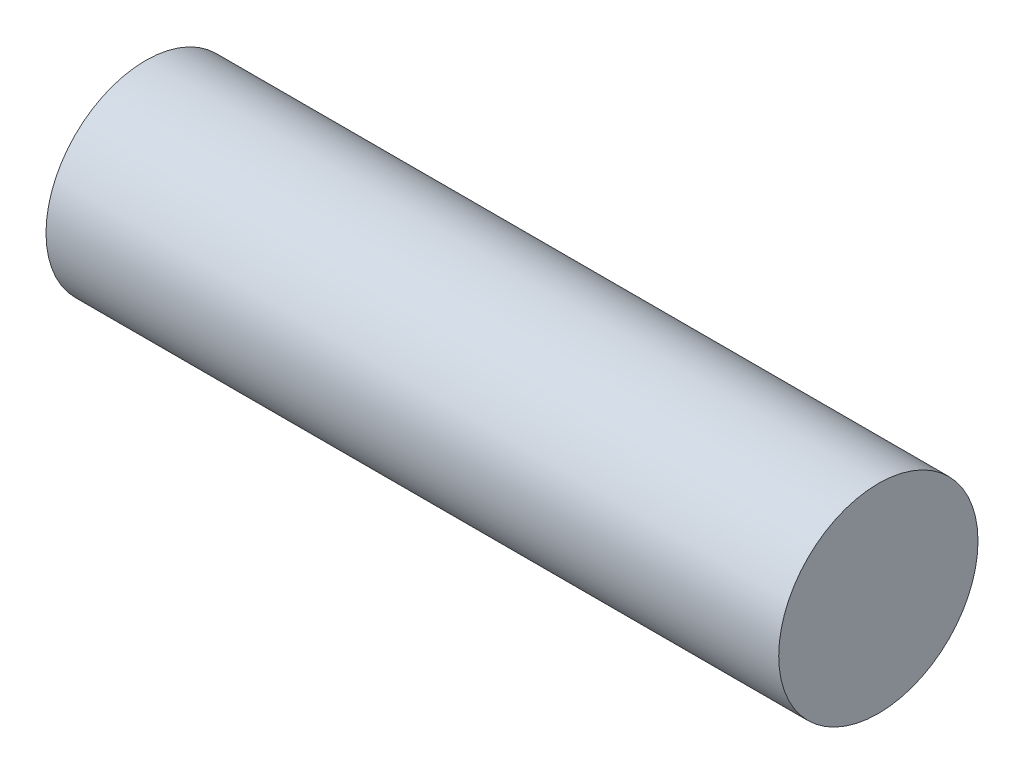
ISO-10303-21;
HEADER;
FILE_DESCRIPTION(('STEP AP214'),'2;1');
FILE_NAME('part.step','',(''),(''),'','','');
FILE_SCHEMA(('AUTOMOTIVE_DESIGN { 1 0 10303 214 1 1 1 1 }'));
ENDSEC;
DATA;
#1=APPLICATION_CONTEXT('core data for automotive mechanical design processes');
#2=APPLICATION_PROTOCOL_DEFINITION('international standard','automotive_design',2000,#1);
#3=PRODUCT_CONTEXT('',#1,'mechanical');
#4=PRODUCT('Part','Part','',(#3));
#5=PRODUCT_RELATED_PRODUCT_CATEGORY('part','',(#4));
#6=PRODUCT_DEFINITION_FORMATION('','',#4);
#7=PRODUCT_DEFINITION_CONTEXT('part definition',#1,'design');
#8=PRODUCT_DEFINITION('design','',#6,#7);
#9=PRODUCT_DEFINITION_SHAPE('','',#8);
#10=(LENGTH_UNIT() NAMED_UNIT(*) SI_UNIT(.MILLI.,.METRE.));
#11=(NAMED_UNIT(*) PLANE_ANGLE_UNIT() SI_UNIT($,.RADIAN.));
#12=(NAMED_UNIT(*) SI_UNIT($,.STERADIAN.) SOLID_ANGLE_UNIT());
#13=UNCERTAINTY_MEASURE_WITH_UNIT(LENGTH_MEASURE(1.E-05),#10,'distance_accuracy_value','');
#14=(GEOMETRIC_REPRESENTATION_CONTEXT(3) GLOBAL_UNCERTAINTY_ASSIGNED_CONTEXT((#13)) GLOBAL_UNIT_ASSIGNED_CONTEXT((#10,
#11,#12)) REPRESENTATION_CONTEXT('',''));
#15=CARTESIAN_POINT('',(0.,0.,0.));
#16=DIRECTION('',(0.,0.,1.));
#17=DIRECTION('',(1.,0.,0.));
#18=AXIS2_PLACEMENT_3D('',#15,#16,#17);
#19=CARTESIAN_POINT('',(250.,0.,0.));
#20=DIRECTION('',(-1.,0.,0.));
#21=DIRECTION('',(0.,0.,1.));
#22=AXIS2_PLACEMENT_3D('',#19,#20,#21);
#23=CYLINDRICAL_SURFACE('',#22,34.);
#24=CARTESIAN_POINT('',(250.,0.,0.));
#25=DIRECTION('',(1.,0.,0.));
#26=DIRECTION('',(0.,0.,-1.));
#27=AXIS2_PLACEMENT_3D('',#24,#25,#26);
#28=CIRCLE('',#27,34.);
#29=CARTESIAN_POINT('',(250.,0.,-34.));
#30=VERTEX_POINT('',#29);
#31=EDGE_CURVE('E10',#30,#30,#28,.T.);
#32=ORIENTED_EDGE('',*,*,#31,.F.);
#33=EDGE_LOOP('',(#32));
#34=FACE_BOUND('',#33,.T.);
#35=CARTESIAN_POINT('',(0.,0.,0.));
#36=DIRECTION('',(1.,0.,0.));
#37=DIRECTION('',(0.,0.,-1.));
#38=AXIS2_PLACEMENT_3D('',#35,#36,#37);
#39=CIRCLE('',#38,34.);
#40=CARTESIAN_POINT('',(0.,0.,-34.));
#41=VERTEX_POINT('',#40);
#42=EDGE_CURVE('E44',#41,#41,#39,.T.);
#43=ORIENTED_EDGE('',*,*,#42,.T.);
#44=EDGE_LOOP('',(#43));
#45=FACE_BOUND('',#44,.T.);
#46=ADVANCED_FACE('F41',(#34,#45),#23,.T.);
#47=CARTESIAN_POINT('',(250.,0.,0.));
#48=DIRECTION('',(1.,0.,0.));
#49=DIRECTION('',(0.,0.,-1.));
#50=AXIS2_PLACEMENT_3D('',#47,#48,#49);
#51=PLANE('',#50);
#52=ORIENTED_EDGE('',*,*,#31,.T.);
#53=EDGE_LOOP('',(#52));
#54=FACE_BOUND('',#53,.T.);
#55=ADVANCED_FACE('F58',(#54),#51,.T.);
#56=CARTESIAN_POINT('',(0.,0.,0.));
#57=DIRECTION('',(1.,0.,0.));
#58=DIRECTION('',(0.,0.,-1.));
#59=AXIS2_PLACEMENT_3D('',#56,#57,#58);
#60=PLANE('',#59);
#61=ORIENTED_EDGE('',*,*,#42,.F.);
#62=EDGE_LOOP('',(#61));
#63=FACE_BOUND('',#62,.T.);
#64=ADVANCED_FACE('F56',(#63),#60,.F.);
#65=CLOSED_SHELL('',(#46,#55,#64));
#66=MANIFOLD_SOLID_BREP('B2',#65);
#67=ADVANCED_BREP_SHAPE_REPRESENTATION('',(#18,#66),#14);
#68=SHAPE_DEFINITION_REPRESENTATION(#9,#67);
ENDSEC;
END-ISO-10303-21;
